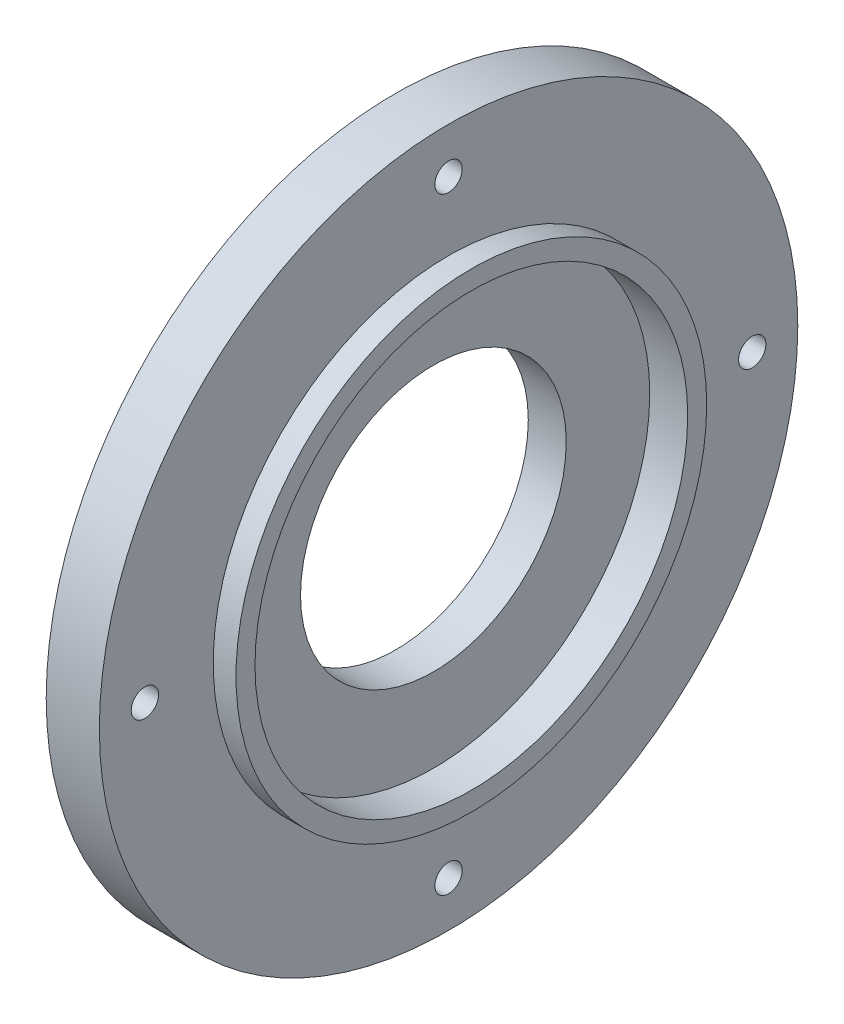
ISO-10303-21;
HEADER;
FILE_DESCRIPTION(('STEP AP214'),'2;1');
FILE_NAME('part.step','',(''),(''),'','','');
FILE_SCHEMA(('AUTOMOTIVE_DESIGN { 1 0 10303 214 1 1 1 1 }'));
ENDSEC;
DATA;
#1=APPLICATION_CONTEXT('core data for automotive mechanical design processes');
#2=APPLICATION_PROTOCOL_DEFINITION('international standard','automotive_design',2000,#1);
#3=PRODUCT_CONTEXT('',#1,'mechanical');
#4=PRODUCT('Part','Part','',(#3));
#5=PRODUCT_RELATED_PRODUCT_CATEGORY('part','',(#4));
#6=PRODUCT_DEFINITION_FORMATION('','',#4);
#7=PRODUCT_DEFINITION_CONTEXT('part definition',#1,'design');
#8=PRODUCT_DEFINITION('design','',#6,#7);
#9=PRODUCT_DEFINITION_SHAPE('','',#8);
#10=(LENGTH_UNIT() NAMED_UNIT(*) SI_UNIT(.MILLI.,.METRE.));
#11=(NAMED_UNIT(*) PLANE_ANGLE_UNIT() SI_UNIT($,.RADIAN.));
#12=(NAMED_UNIT(*) SI_UNIT($,.STERADIAN.) SOLID_ANGLE_UNIT());
#13=UNCERTAINTY_MEASURE_WITH_UNIT(LENGTH_MEASURE(1.E-05),#10,'distance_accuracy_value','');
#14=(GEOMETRIC_REPRESENTATION_CONTEXT(3) GLOBAL_UNCERTAINTY_ASSIGNED_CONTEXT((#13)) GLOBAL_UNIT_ASSIGNED_CONTEXT((#10,
#11,#12)) REPRESENTATION_CONTEXT('',''));
#15=CARTESIAN_POINT('',(0.,0.,0.));
#16=DIRECTION('',(0.,0.,1.));
#17=DIRECTION('',(1.,0.,0.));
#18=AXIS2_PLACEMENT_3D('',#15,#16,#17);
#19=CARTESIAN_POINT('',(5.,0.,0.));
#20=DIRECTION('',(1.,0.,0.));
#21=DIRECTION('',(0.,0.,-1.));
#22=AXIS2_PLACEMENT_3D('',#19,#20,#21);
#23=PLANE('',#22);
#24=CARTESIAN_POINT('',(5.,0.,0.));
#25=DIRECTION('',(1.,0.,0.));
#26=DIRECTION('',(0.,0.,-1.));
#27=AXIS2_PLACEMENT_3D('',#24,#25,#26);
#28=CIRCLE('',#27,17.5);
#29=CARTESIAN_POINT('',(5.,0.,-17.5));
#30=VERTEX_POINT('',#29);
#31=EDGE_CURVE('E48',#30,#30,#28,.T.);
#32=ORIENTED_EDGE('',*,*,#31,.F.);
#33=EDGE_LOOP('',(#32));
#34=FACE_BOUND('',#33,.T.);
#35=CARTESIAN_POINT('',(5.,0.,0.));
#36=DIRECTION('',(1.,0.,0.));
#37=DIRECTION('',(0.,0.,-1.));
#38=AXIS2_PLACEMENT_3D('',#35,#36,#37);
#39=CIRCLE('',#38,28.5);
#40=CARTESIAN_POINT('',(5.,0.,-28.5));
#41=VERTEX_POINT('',#40);
#42=EDGE_CURVE('E10',#41,#41,#39,.F.);
#43=ORIENTED_EDGE('',*,*,#42,.F.);
#44=EDGE_LOOP('',(#43));
#45=FACE_BOUND('',#44,.T.);
#46=ADVANCED_FACE('F37',(#34,#45),#23,.T.);
#47=CARTESIAN_POINT('',(0.,0.,0.));
#48=DIRECTION('',(1.,0.,0.));
#49=DIRECTION('',(0.,0.,-1.));
#50=AXIS2_PLACEMENT_3D('',#47,#48,#49);
#51=PLANE('',#50);
#52=CARTESIAN_POINT('',(0.,40.,0.));
#53=DIRECTION('',(-1.,0.,0.));
#54=DIRECTION('',(0.,0.,1.));
#55=AXIS2_PLACEMENT_3D('',#52,#53,#54);
#56=CIRCLE('',#55,1.8);
#57=CARTESIAN_POINT('',(0.,40.,1.8));
#58=VERTEX_POINT('',#57);
#59=EDGE_CURVE('E86',#58,#58,#56,.T.);
#60=ORIENTED_EDGE('',*,*,#59,.F.);
#61=EDGE_LOOP('',(#60));
#62=FACE_BOUND('',#61,.T.);
#63=CARTESIAN_POINT('',(0.,-1.41934719169196E-13,40.));
#64=DIRECTION('',(-1.,0.,0.));
#65=DIRECTION('',(0.,0.,1.));
#66=AXIS2_PLACEMENT_3D('',#63,#64,#65);
#67=CIRCLE('',#66,1.8);
#68=CARTESIAN_POINT('',(0.,-1.41934719169196E-13,41.8));
#69=VERTEX_POINT('',#68);
#70=EDGE_CURVE('E80',#69,#69,#67,.T.);
#71=ORIENTED_EDGE('',*,*,#70,.F.);
#72=EDGE_LOOP('',(#71));
#73=FACE_BOUND('',#72,.T.);
#74=CARTESIAN_POINT('',(0.,-40.,2.26131645845802E-12));
#75=DIRECTION('',(-1.,0.,0.));
#76=DIRECTION('',(0.,0.,1.));
#77=AXIS2_PLACEMENT_3D('',#74,#75,#76);
#78=CIRCLE('',#77,1.80000000000243);
#79=CARTESIAN_POINT('',(0.,-40.,1.80000000000469));
#80=VERTEX_POINT('',#79);
#81=EDGE_CURVE('E73',#80,#80,#78,.T.);
#82=ORIENTED_EDGE('',*,*,#81,.F.);
#83=EDGE_LOOP('',(#82));
#84=FACE_BOUND('',#83,.T.);
#85=CARTESIAN_POINT('',(0.,-1.13441908361787E-12,-39.9999999999989));
#86=DIRECTION('',(-1.,0.,0.));
#87=DIRECTION('',(0.,0.,1.));
#88=AXIS2_PLACEMENT_3D('',#85,#86,#87);
#89=CIRCLE('',#88,1.80000000000183);
#90=CARTESIAN_POINT('',(0.,-1.13441908361787E-12,-38.199999999997));
#91=VERTEX_POINT('',#90);
#92=EDGE_CURVE('E74',#91,#91,#89,.T.);
#93=ORIENTED_EDGE('',*,*,#92,.F.);
#94=EDGE_LOOP('',(#93));
#95=FACE_BOUND('',#94,.T.);
#96=CARTESIAN_POINT('',(0.,0.,0.));
#97=DIRECTION('',(1.,0.,0.));
#98=DIRECTION('',(0.,0.,-1.));
#99=AXIS2_PLACEMENT_3D('',#96,#97,#98);
#100=CIRCLE('',#99,46.);
#101=CARTESIAN_POINT('',(0.,0.,-46.));
#102=VERTEX_POINT('',#101);
#103=EDGE_CURVE('E44',#102,#102,#100,.T.);
#104=ORIENTED_EDGE('',*,*,#103,.F.);
#105=EDGE_LOOP('',(#104));
#106=FACE_BOUND('',#105,.T.);
#107=CARTESIAN_POINT('',(0.,0.,0.));
#108=DIRECTION('',(1.,0.,0.));
#109=DIRECTION('',(0.,0.,-1.));
#110=AXIS2_PLACEMENT_3D('',#107,#108,#109);
#111=CIRCLE('',#110,17.5);
#112=CARTESIAN_POINT('',(0.,0.,-17.5));
#113=VERTEX_POINT('',#112);
#114=EDGE_CURVE('E52',#113,#113,#111,.T.);
#115=ORIENTED_EDGE('',*,*,#114,.T.);
#116=EDGE_LOOP('',(#115));
#117=FACE_BOUND('',#116,.T.);
#118=ADVANCED_FACE('F97',(#62,#73,#84,#95,#106,#117),#51,.F.);
#119=CARTESIAN_POINT('',(5.,0.,0.));
#120=DIRECTION('',(-1.,0.,0.));
#121=DIRECTION('',(0.,0.,1.));
#122=AXIS2_PLACEMENT_3D('',#119,#120,#121);
#123=CYLINDRICAL_SURFACE('',#122,46.);
#124=ORIENTED_EDGE('',*,*,#103,.T.);
#125=EDGE_LOOP('',(#124));
#126=FACE_BOUND('',#125,.T.);
#127=CARTESIAN_POINT('',(7.,0.,0.));
#128=DIRECTION('',(1.,0.,0.));
#129=DIRECTION('',(0.,0.,-1.));
#130=AXIS2_PLACEMENT_3D('',#127,#128,#129);
#131=CIRCLE('',#130,46.);
#132=CARTESIAN_POINT('',(7.,0.,-46.));
#133=VERTEX_POINT('',#132);
#134=EDGE_CURVE('E63',#133,#133,#131,.T.);
#135=ORIENTED_EDGE('',*,*,#134,.F.);
#136=EDGE_LOOP('',(#135));
#137=FACE_BOUND('',#136,.T.);
#138=ADVANCED_FACE('F39',(#126,#137),#123,.T.);
#139=CARTESIAN_POINT('',(5.,0.,0.));
#140=DIRECTION('',(-1.,0.,0.));
#141=DIRECTION('',(0.,0.,1.));
#142=AXIS2_PLACEMENT_3D('',#139,#140,#141);
#143=CYLINDRICAL_SURFACE('',#142,17.5);
#144=ORIENTED_EDGE('',*,*,#31,.T.);
#145=EDGE_LOOP('',(#144));
#146=FACE_BOUND('',#145,.T.);
#147=ORIENTED_EDGE('',*,*,#114,.F.);
#148=EDGE_LOOP('',(#147));
#149=FACE_BOUND('',#148,.T.);
#150=ADVANCED_FACE('F109',(#146,#149),#143,.F.);
#151=CARTESIAN_POINT('',(10.,0.,0.));
#152=DIRECTION('',(1.,0.,0.));
#153=DIRECTION('',(0.,0.,-1.));
#154=AXIS2_PLACEMENT_3D('',#151,#152,#153);
#155=PLANE('',#154);
#156=CARTESIAN_POINT('',(10.,0.,0.));
#157=DIRECTION('',(1.,0.,0.));
#158=DIRECTION('',(0.,0.,-1.));
#159=AXIS2_PLACEMENT_3D('',#156,#157,#158);
#160=CIRCLE('',#159,31.);
#161=CARTESIAN_POINT('',(10.,0.,-31.));
#162=VERTEX_POINT('',#161);
#163=EDGE_CURVE('E56',#162,#162,#160,.T.);
#164=ORIENTED_EDGE('',*,*,#163,.T.);
#165=EDGE_LOOP('',(#164));
#166=FACE_BOUND('',#165,.T.);
#167=CARTESIAN_POINT('',(10.,0.,0.));
#168=DIRECTION('',(1.,0.,0.));
#169=DIRECTION('',(0.,0.,-1.));
#170=AXIS2_PLACEMENT_3D('',#167,#168,#169);
#171=CIRCLE('',#170,28.5);
#172=CARTESIAN_POINT('',(10.,0.,-28.5));
#173=VERTEX_POINT('',#172);
#174=EDGE_CURVE('E60',#173,#173,#171,.T.);
#175=ORIENTED_EDGE('',*,*,#174,.F.);
#176=EDGE_LOOP('',(#175));
#177=FACE_BOUND('',#176,.T.);
#178=ADVANCED_FACE('F111',(#166,#177),#155,.T.);
#179=CARTESIAN_POINT('',(10.,0.,0.));
#180=DIRECTION('',(-1.,0.,0.));
#181=DIRECTION('',(0.,0.,1.));
#182=AXIS2_PLACEMENT_3D('',#179,#180,#181);
#183=CYLINDRICAL_SURFACE('',#182,31.);
#184=CARTESIAN_POINT('',(7.,0.,0.));
#185=DIRECTION('',(1.,0.,0.));
#186=DIRECTION('',(0.,0.,-1.));
#187=AXIS2_PLACEMENT_3D('',#184,#185,#186);
#188=CIRCLE('',#187,31.);
#189=CARTESIAN_POINT('',(7.,0.,-31.));
#190=VERTEX_POINT('',#189);
#191=EDGE_CURVE('E66',#190,#190,#188,.T.);
#192=ORIENTED_EDGE('',*,*,#191,.T.);
#193=EDGE_LOOP('',(#192));
#194=FACE_BOUND('',#193,.T.);
#195=ORIENTED_EDGE('',*,*,#163,.F.);
#196=EDGE_LOOP('',(#195));
#197=FACE_BOUND('',#196,.T.);
#198=ADVANCED_FACE('F118',(#194,#197),#183,.T.);
#199=CARTESIAN_POINT('',(10.,0.,0.));
#200=DIRECTION('',(-1.,0.,0.));
#201=DIRECTION('',(0.,0.,1.));
#202=AXIS2_PLACEMENT_3D('',#199,#200,#201);
#203=CYLINDRICAL_SURFACE('',#202,28.5);
#204=ORIENTED_EDGE('',*,*,#174,.T.);
#205=EDGE_LOOP('',(#204));
#206=FACE_BOUND('',#205,.T.);
#207=ORIENTED_EDGE('',*,*,#42,.T.);
#208=EDGE_LOOP('',(#207));
#209=FACE_BOUND('',#208,.T.);
#210=ADVANCED_FACE('F148',(#206,#209),#203,.F.);
#211=CARTESIAN_POINT('',(7.,0.,0.));
#212=DIRECTION('',(1.,0.,0.));
#213=DIRECTION('',(0.,0.,-1.));
#214=AXIS2_PLACEMENT_3D('',#211,#212,#213);
#215=PLANE('',#214);
#216=CARTESIAN_POINT('',(7.,40.,0.));
#217=DIRECTION('',(1.,0.,0.));
#218=DIRECTION('',(0.,0.,-1.));
#219=AXIS2_PLACEMENT_3D('',#216,#217,#218);
#220=CIRCLE('',#219,1.8);
#221=CARTESIAN_POINT('',(7.,40.,-1.8));
#222=VERTEX_POINT('',#221);
#223=EDGE_CURVE('E69',#222,#222,#220,.F.);
#224=ORIENTED_EDGE('',*,*,#223,.T.);
#225=EDGE_LOOP('',(#224));
#226=FACE_BOUND('',#225,.T.);
#227=CARTESIAN_POINT('',(7.,-1.41934719169196E-13,40.));
#228=DIRECTION('',(1.,0.,0.));
#229=DIRECTION('',(0.,0.,-1.));
#230=AXIS2_PLACEMENT_3D('',#227,#228,#229);
#231=CIRCLE('',#230,1.8);
#232=CARTESIAN_POINT('',(7.,-1.41934719169196E-13,38.2));
#233=VERTEX_POINT('',#232);
#234=EDGE_CURVE('E83',#233,#233,#231,.F.);
#235=ORIENTED_EDGE('',*,*,#234,.T.);
#236=EDGE_LOOP('',(#235));
#237=FACE_BOUND('',#236,.T.);
#238=CARTESIAN_POINT('',(7.,-40.,2.26131645845802E-12));
#239=DIRECTION('',(1.,0.,0.));
#240=DIRECTION('',(0.,0.,-1.));
#241=AXIS2_PLACEMENT_3D('',#238,#239,#240);
#242=CIRCLE('',#241,1.80000000000243);
#243=CARTESIAN_POINT('',(7.,-40.,-1.80000000000017));
#244=VERTEX_POINT('',#243);
#245=EDGE_CURVE('E77',#244,#244,#242,.F.);
#246=ORIENTED_EDGE('',*,*,#245,.T.);
#247=EDGE_LOOP('',(#246));
#248=FACE_BOUND('',#247,.T.);
#249=CARTESIAN_POINT('',(7.,-1.13441908361787E-12,-39.9999999999989));
#250=DIRECTION('',(1.,0.,0.));
#251=DIRECTION('',(0.,0.,-1.));
#252=AXIS2_PLACEMENT_3D('',#249,#250,#251);
#253=CIRCLE('',#252,1.80000000000183);
#254=CARTESIAN_POINT('',(7.,-1.13441908361787E-12,-41.8000000000007));
#255=VERTEX_POINT('',#254);
#256=EDGE_CURVE('E70',#255,#255,#253,.F.);
#257=ORIENTED_EDGE('',*,*,#256,.T.);
#258=EDGE_LOOP('',(#257));
#259=FACE_BOUND('',#258,.T.);
#260=ORIENTED_EDGE('',*,*,#134,.T.);
#261=EDGE_LOOP('',(#260));
#262=FACE_BOUND('',#261,.T.);
#263=ORIENTED_EDGE('',*,*,#191,.F.);
#264=EDGE_LOOP('',(#263));
#265=FACE_BOUND('',#264,.T.);
#266=ADVANCED_FACE('F162',(#226,#237,#248,#259,#262,#265),#215,.T.);
#267=CARTESIAN_POINT('',(12.09116882455,-1.13441908361787E-12,-39.9999999999989));
#268=DIRECTION('',(-1.,0.,0.));
#269=DIRECTION('',(0.,0.,1.));
#270=AXIS2_PLACEMENT_3D('',#267,#268,#269);
#271=CYLINDRICAL_SURFACE('',#270,1.80000000000183);
#272=ORIENTED_EDGE('',*,*,#92,.T.);
#273=EDGE_LOOP('',(#272));
#274=FACE_BOUND('',#273,.T.);
#275=ORIENTED_EDGE('',*,*,#256,.F.);
#276=EDGE_LOOP('',(#275));
#277=FACE_BOUND('',#276,.T.);
#278=ADVANCED_FACE('F167',(#274,#277),#271,.F.);
#279=CARTESIAN_POINT('',(12.09116882455,-40.,2.26131645845802E-12));
#280=DIRECTION('',(-1.,0.,0.));
#281=DIRECTION('',(0.,0.,1.));
#282=AXIS2_PLACEMENT_3D('',#279,#280,#281);
#283=CYLINDRICAL_SURFACE('',#282,1.80000000000243);
#284=ORIENTED_EDGE('',*,*,#81,.T.);
#285=EDGE_LOOP('',(#284));
#286=FACE_BOUND('',#285,.T.);
#287=ORIENTED_EDGE('',*,*,#245,.F.);
#288=EDGE_LOOP('',(#287));
#289=FACE_BOUND('',#288,.T.);
#290=ADVANCED_FACE('F174',(#286,#289),#283,.F.);
#291=CARTESIAN_POINT('',(12.09116882455,-1.41934719169196E-13,40.));
#292=DIRECTION('',(-1.,0.,0.));
#293=DIRECTION('',(0.,0.,1.));
#294=AXIS2_PLACEMENT_3D('',#291,#292,#293);
#295=CYLINDRICAL_SURFACE('',#294,1.8);
#296=ORIENTED_EDGE('',*,*,#70,.T.);
#297=EDGE_LOOP('',(#296));
#298=FACE_BOUND('',#297,.T.);
#299=ORIENTED_EDGE('',*,*,#234,.F.);
#300=EDGE_LOOP('',(#299));
#301=FACE_BOUND('',#300,.T.);
#302=ADVANCED_FACE('F182',(#298,#301),#295,.F.);
#303=CARTESIAN_POINT('',(12.09116882455,40.,0.));
#304=DIRECTION('',(-1.,0.,0.));
#305=DIRECTION('',(0.,0.,1.));
#306=AXIS2_PLACEMENT_3D('',#303,#304,#305);
#307=CYLINDRICAL_SURFACE('',#306,1.8);
#308=ORIENTED_EDGE('',*,*,#59,.T.);
#309=EDGE_LOOP('',(#308));
#310=FACE_BOUND('',#309,.T.);
#311=ORIENTED_EDGE('',*,*,#223,.F.);
#312=EDGE_LOOP('',(#311));
#313=FACE_BOUND('',#312,.T.);
#314=ADVANCED_FACE('F94',(#310,#313),#307,.F.);
#315=CLOSED_SHELL('',(#46,#118,#138,#150,#178,#198,#210,#266,#278,#290,#302,#314));
#316=MANIFOLD_SOLID_BREP('B2',#315);
#317=ADVANCED_BREP_SHAPE_REPRESENTATION('',(#18,#316),#14);
#318=SHAPE_DEFINITION_REPRESENTATION(#9,#317);
ENDSEC;
END-ISO-10303-21;
